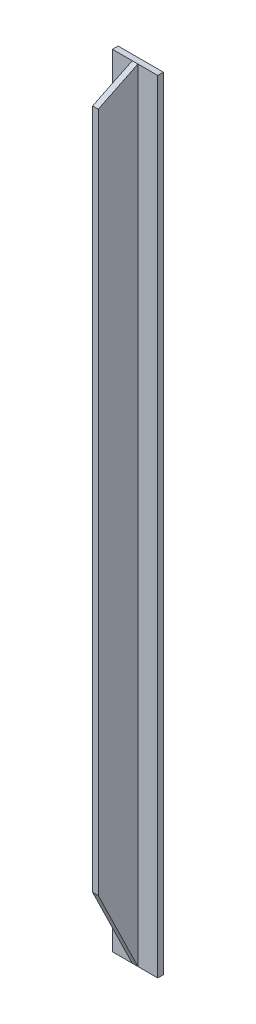
ISO-10303-21;
HEADER;
FILE_DESCRIPTION(('STEP AP214'),'2;1');
FILE_NAME('part.step','',(''),(''),'','','');
FILE_SCHEMA(('AUTOMOTIVE_DESIGN { 1 0 10303 214 1 1 1 1 }'));
ENDSEC;
DATA;
#1=APPLICATION_CONTEXT('core data for automotive mechanical design processes');
#2=APPLICATION_PROTOCOL_DEFINITION('international standard','automotive_design',2000,#1);
#3=PRODUCT_CONTEXT('',#1,'mechanical');
#4=PRODUCT('Part','Part','',(#3));
#5=PRODUCT_RELATED_PRODUCT_CATEGORY('part','',(#4));
#6=PRODUCT_DEFINITION_FORMATION('','',#4);
#7=PRODUCT_DEFINITION_CONTEXT('part definition',#1,'design');
#8=PRODUCT_DEFINITION('design','',#6,#7);
#9=PRODUCT_DEFINITION_SHAPE('','',#8);
#10=(LENGTH_UNIT() NAMED_UNIT(*) SI_UNIT(.MILLI.,.METRE.));
#11=(NAMED_UNIT(*) PLANE_ANGLE_UNIT() SI_UNIT($,.RADIAN.));
#12=(NAMED_UNIT(*) SI_UNIT($,.STERADIAN.) SOLID_ANGLE_UNIT());
#13=UNCERTAINTY_MEASURE_WITH_UNIT(LENGTH_MEASURE(1.E-05),#10,'distance_accuracy_value','');
#14=(GEOMETRIC_REPRESENTATION_CONTEXT(3) GLOBAL_UNCERTAINTY_ASSIGNED_CONTEXT((#13)) GLOBAL_UNIT_ASSIGNED_CONTEXT((#10,
#11,#12)) REPRESENTATION_CONTEXT('',''));
#15=CARTESIAN_POINT('',(0.,0.,0.));
#16=DIRECTION('',(0.,0.,1.));
#17=DIRECTION('',(1.,0.,0.));
#18=AXIS2_PLACEMENT_3D('',#15,#16,#17);
#19=CARTESIAN_POINT('',(14.2875,438.15,-22.225));
#20=DIRECTION('',(0.,0.,-1.));
#21=DIRECTION('',(-1.,0.,0.));
#22=AXIS2_PLACEMENT_3D('',#19,#20,#21);
#23=PLANE('',#22);
#24=DIRECTION('',(1.,0.,0.));
#25=VECTOR('',#24,1.);
#26=CARTESIAN_POINT('',(14.2875,0.,-22.225));
#27=LINE('',#26,#25);
#28=CARTESIAN_POINT('',(3.175,0.,-22.225));
#29=VERTEX_POINT('',#28);
#30=CARTESIAN_POINT('',(14.2875,0.,-22.225));
#31=VERTEX_POINT('',#30);
#32=EDGE_CURVE('E130',#29,#31,#27,.T.);
#33=ORIENTED_EDGE('',*,*,#32,.T.);
#34=DIRECTION('',(0.,-1.,0.));
#35=VECTOR('',#34,1.);
#36=CARTESIAN_POINT('',(14.2875,438.15,-22.225));
#37=LINE('',#36,#35);
#38=CARTESIAN_POINT('',(14.2875,438.15,-22.225));
#39=VERTEX_POINT('',#38);
#40=EDGE_CURVE('E166',#39,#31,#37,.T.);
#41=ORIENTED_EDGE('',*,*,#40,.F.);
#42=DIRECTION('',(1.,0.,0.));
#43=VECTOR('',#42,1.);
#44=CARTESIAN_POINT('',(14.2875,438.15,-22.225));
#45=LINE('',#44,#43);
#46=CARTESIAN_POINT('',(3.175,438.15,-22.225));
#47=VERTEX_POINT('',#46);
#48=EDGE_CURVE('E146',#47,#39,#45,.T.);
#49=ORIENTED_EDGE('',*,*,#48,.F.);
#50=DIRECTION('',(0.,-1.,0.));
#51=VECTOR('',#50,1.);
#52=CARTESIAN_POINT('',(3.175,438.15,-22.225));
#53=LINE('',#52,#51);
#54=EDGE_CURVE('E126',#47,#29,#53,.T.);
#55=ORIENTED_EDGE('',*,*,#54,.T.);
#56=EDGE_LOOP('',(#33,#41,#49,#55));
#57=FACE_BOUND('',#56,.T.);
#58=ADVANCED_FACE('F39',(#57),#23,.F.);
#59=CARTESIAN_POINT('',(14.2875,438.15,-22.225));
#60=DIRECTION('',(-1.,0.,0.));
#61=DIRECTION('',(0.,0.,1.));
#62=AXIS2_PLACEMENT_3D('',#59,#60,#61);
#63=PLANE('',#62);
#64=DIRECTION('',(0.,0.,-1.));
#65=VECTOR('',#64,1.);
#66=CARTESIAN_POINT('',(14.2875,0.,-22.225));
#67=LINE('',#66,#65);
#68=CARTESIAN_POINT('',(14.2875,0.,-25.4));
#69=VERTEX_POINT('',#68);
#70=EDGE_CURVE('E134',#31,#69,#67,.T.);
#71=ORIENTED_EDGE('',*,*,#70,.T.);
#72=DIRECTION('',(0.,-1.,0.));
#73=VECTOR('',#72,1.);
#74=CARTESIAN_POINT('',(14.2875,438.15,-25.4));
#75=LINE('',#74,#73);
#76=CARTESIAN_POINT('',(14.2875,438.15,-25.4));
#77=VERTEX_POINT('',#76);
#78=EDGE_CURVE('E117',#77,#69,#75,.T.);
#79=ORIENTED_EDGE('',*,*,#78,.F.);
#80=DIRECTION('',(0.,0.,-1.));
#81=VECTOR('',#80,1.);
#82=CARTESIAN_POINT('',(14.2875,438.15,-22.225));
#83=LINE('',#82,#81);
#84=EDGE_CURVE('E94',#39,#77,#83,.T.);
#85=ORIENTED_EDGE('',*,*,#84,.F.);
#86=ORIENTED_EDGE('',*,*,#40,.T.);
#87=EDGE_LOOP('',(#71,#79,#85,#86));
#88=FACE_BOUND('',#87,.T.);
#89=ADVANCED_FACE('F193',(#88),#63,.F.);
#90=CARTESIAN_POINT('',(14.2875,438.15,-25.4));
#91=DIRECTION('',(0.,0.,1.));
#92=DIRECTION('',(1.,0.,0.));
#93=AXIS2_PLACEMENT_3D('',#90,#91,#92);
#94=PLANE('',#93);
#95=DIRECTION('',(-1.,0.,0.));
#96=VECTOR('',#95,1.);
#97=CARTESIAN_POINT('',(14.2875,0.,-25.4));
#98=LINE('',#97,#96);
#99=CARTESIAN_POINT('',(-11.1125,0.,-25.4));
#100=VERTEX_POINT('',#99);
#101=EDGE_CURVE('E115',#69,#100,#98,.T.);
#102=ORIENTED_EDGE('',*,*,#101,.T.);
#103=DIRECTION('',(0.,-1.,0.));
#104=VECTOR('',#103,1.);
#105=CARTESIAN_POINT('',(-11.1125,438.15,-25.4));
#106=LINE('',#105,#104);
#107=CARTESIAN_POINT('',(-11.1125,438.15,-25.4));
#108=VERTEX_POINT('',#107);
#109=EDGE_CURVE('E112',#108,#100,#106,.T.);
#110=ORIENTED_EDGE('',*,*,#109,.F.);
#111=DIRECTION('',(-1.,0.,0.));
#112=VECTOR('',#111,1.);
#113=CARTESIAN_POINT('',(14.2875,438.15,-25.4));
#114=LINE('',#113,#112);
#115=EDGE_CURVE('E102',#77,#108,#114,.T.);
#116=ORIENTED_EDGE('',*,*,#115,.F.);
#117=ORIENTED_EDGE('',*,*,#78,.T.);
#118=EDGE_LOOP('',(#102,#110,#116,#117));
#119=FACE_BOUND('',#118,.T.);
#120=ADVANCED_FACE('F113',(#119),#94,.F.);
#121=CARTESIAN_POINT('',(-11.1125,438.15,-22.225));
#122=DIRECTION('',(1.,0.,0.));
#123=DIRECTION('',(0.,0.,-1.));
#124=AXIS2_PLACEMENT_3D('',#121,#122,#123);
#125=PLANE('',#124);
#126=DIRECTION('',(0.,0.,1.));
#127=VECTOR('',#126,1.);
#128=CARTESIAN_POINT('',(-11.1125,0.,-22.225));
#129=LINE('',#128,#127);
#130=CARTESIAN_POINT('',(-11.1125,0.,-22.225));
#131=VERTEX_POINT('',#130);
#132=EDGE_CURVE('E77',#100,#131,#129,.T.);
#133=ORIENTED_EDGE('',*,*,#132,.T.);
#134=DIRECTION('',(0.,-1.,0.));
#135=VECTOR('',#134,1.);
#136=CARTESIAN_POINT('',(-11.1125,438.15,-22.225));
#137=LINE('',#136,#135);
#138=CARTESIAN_POINT('',(-11.1125,438.15,-22.225));
#139=VERTEX_POINT('',#138);
#140=EDGE_CURVE('E118',#139,#131,#137,.T.);
#141=ORIENTED_EDGE('',*,*,#140,.F.);
#142=DIRECTION('',(0.,0.,1.));
#143=VECTOR('',#142,1.);
#144=CARTESIAN_POINT('',(-11.1125,438.15,-22.225));
#145=LINE('',#144,#143);
#146=EDGE_CURVE('E107',#108,#139,#145,.T.);
#147=ORIENTED_EDGE('',*,*,#146,.F.);
#148=ORIENTED_EDGE('',*,*,#109,.T.);
#149=EDGE_LOOP('',(#133,#141,#147,#148));
#150=FACE_BOUND('',#149,.T.);
#151=ADVANCED_FACE('F120',(#150),#125,.F.);
#152=CARTESIAN_POINT('',(0.,438.15,-22.225));
#153=DIRECTION('',(0.,0.,-1.));
#154=DIRECTION('',(-1.,0.,0.));
#155=AXIS2_PLACEMENT_3D('',#152,#153,#154);
#156=PLANE('',#155);
#157=DIRECTION('',(1.,0.,0.));
#158=VECTOR('',#157,1.);
#159=CARTESIAN_POINT('',(0.,0.,-22.225));
#160=LINE('',#159,#158);
#161=CARTESIAN_POINT('',(0.,0.,-22.225));
#162=VERTEX_POINT('',#161);
#163=EDGE_CURVE('E142',#131,#162,#160,.T.);
#164=ORIENTED_EDGE('',*,*,#163,.T.);
#165=DIRECTION('',(0.,-1.,0.));
#166=VECTOR('',#165,1.);
#167=CARTESIAN_POINT('',(0.,438.15,-22.225));
#168=LINE('',#167,#166);
#169=CARTESIAN_POINT('',(0.,438.15,-22.225));
#170=VERTEX_POINT('',#169);
#171=EDGE_CURVE('E158',#170,#162,#168,.T.);
#172=ORIENTED_EDGE('',*,*,#171,.F.);
#173=DIRECTION('',(1.,0.,0.));
#174=VECTOR('',#173,1.);
#175=CARTESIAN_POINT('',(0.,438.15,-22.225));
#176=LINE('',#175,#174);
#177=EDGE_CURVE('E123',#139,#170,#176,.T.);
#178=ORIENTED_EDGE('',*,*,#177,.F.);
#179=ORIENTED_EDGE('',*,*,#140,.T.);
#180=EDGE_LOOP('',(#164,#172,#178,#179));
#181=FACE_BOUND('',#180,.T.);
#182=ADVANCED_FACE('F203',(#181),#156,.F.);
#183=CARTESIAN_POINT('',(0.,438.15,0.));
#184=DIRECTION('',(1.,0.,0.));
#185=DIRECTION('',(0.,0.,-1.));
#186=AXIS2_PLACEMENT_3D('',#183,#184,#185);
#187=PLANE('',#186);
#188=ORIENTED_EDGE('',*,*,#171,.T.);
#189=DIRECTION('',(0.,0.898794046299165,0.438371146789081));
#190=VECTOR('',#189,1.);
#191=CARTESIAN_POINT('',(0.,362.707807206422,154.679417701838));
#192=LINE('',#191,#190);
#193=CARTESIAN_POINT('',(0.,45.5680028790993,0.));
#194=VERTEX_POINT('',#193);
#195=EDGE_CURVE('E85',#162,#194,#192,.T.);
#196=ORIENTED_EDGE('',*,*,#195,.T.);
#197=DIRECTION('',(0.,-1.,0.));
#198=VECTOR('',#197,1.);
#199=CARTESIAN_POINT('',(0.,438.15,0.));
#200=LINE('',#199,#198);
#201=CARTESIAN_POINT('',(0.,427.310143219124,0.));
#202=VERTEX_POINT('',#201);
#203=EDGE_CURVE('E154',#202,#194,#200,.T.);
#204=ORIENTED_EDGE('',*,*,#203,.F.);
#205=DIRECTION('',(0.,0.438371146789073,-0.898794046299169));
#206=VECTOR('',#205,1.);
#207=CARTESIAN_POINT('',(0.,429.393230500545,-4.27096185544353));
#208=LINE('',#207,#206);
#209=EDGE_CURVE('E135',#202,#170,#208,.T.);
#210=ORIENTED_EDGE('',*,*,#209,.T.);
#211=EDGE_LOOP('',(#188,#196,#204,#210));
#212=FACE_BOUND('',#211,.T.);
#213=ADVANCED_FACE('F206',(#212),#187,.F.);
#214=CARTESIAN_POINT('',(0.,438.15,0.));
#215=DIRECTION('',(0.,0.,-1.));
#216=DIRECTION('',(-1.,0.,0.));
#217=AXIS2_PLACEMENT_3D('',#214,#215,#216);
#218=PLANE('',#217);
#219=ORIENTED_EDGE('',*,*,#203,.T.);
#220=DIRECTION('',(1.,0.,0.));
#221=VECTOR('',#220,1.);
#222=CARTESIAN_POINT('',(-434.975,45.5680028790993,0.));
#223=LINE('',#222,#221);
#224=CARTESIAN_POINT('',(3.175,45.5680028790993,0.));
#225=VERTEX_POINT('',#224);
#226=EDGE_CURVE('E187',#194,#225,#223,.T.);
#227=ORIENTED_EDGE('',*,*,#226,.T.);
#228=DIRECTION('',(0.,-1.,0.));
#229=VECTOR('',#228,1.);
#230=CARTESIAN_POINT('',(3.175,438.15,0.));
#231=LINE('',#230,#229);
#232=CARTESIAN_POINT('',(3.175,427.310143219124,0.));
#233=VERTEX_POINT('',#232);
#234=EDGE_CURVE('E150',#233,#225,#231,.T.);
#235=ORIENTED_EDGE('',*,*,#234,.F.);
#236=DIRECTION('',(1.,0.,0.));
#237=VECTOR('',#236,1.);
#238=CARTESIAN_POINT('',(-434.975,427.310143219124,0.));
#239=LINE('',#238,#237);
#240=EDGE_CURVE('E188',#202,#233,#239,.T.);
#241=ORIENTED_EDGE('',*,*,#240,.F.);
#242=EDGE_LOOP('',(#219,#227,#235,#241));
#243=FACE_BOUND('',#242,.T.);
#244=ADVANCED_FACE('F210',(#243),#218,.F.);
#245=CARTESIAN_POINT('',(3.175,438.15,0.));
#246=DIRECTION('',(-1.,0.,0.));
#247=DIRECTION('',(0.,0.,1.));
#248=AXIS2_PLACEMENT_3D('',#245,#246,#247);
#249=PLANE('',#248);
#250=ORIENTED_EDGE('',*,*,#234,.T.);
#251=DIRECTION('',(0.,0.898794046299165,0.438371146789081));
#252=VECTOR('',#251,1.);
#253=CARTESIAN_POINT('',(3.175,0.,-22.225));
#254=LINE('',#253,#252);
#255=EDGE_CURVE('E174',#29,#225,#254,.T.);
#256=ORIENTED_EDGE('',*,*,#255,.F.);
#257=ORIENTED_EDGE('',*,*,#54,.F.);
#258=DIRECTION('',(0.,0.438371146789073,-0.898794046299169));
#259=VECTOR('',#258,1.);
#260=CARTESIAN_POINT('',(3.175,438.15,-22.225));
#261=LINE('',#260,#259);
#262=EDGE_CURVE('E56',#233,#47,#261,.T.);
#263=ORIENTED_EDGE('',*,*,#262,.F.);
#264=EDGE_LOOP('',(#250,#256,#257,#263));
#265=FACE_BOUND('',#264,.T.);
#266=ADVANCED_FACE('F183',(#265),#249,.F.);
#267=CARTESIAN_POINT('',(0.,438.15,0.));
#268=DIRECTION('',(0.,-1.,0.));
#269=DIRECTION('',(0.,0.,-1.));
#270=AXIS2_PLACEMENT_3D('',#267,#268,#269);
#271=PLANE('',#270);
#272=ORIENTED_EDGE('',*,*,#177,.T.);
#273=DIRECTION('',(1.,0.,0.));
#274=VECTOR('',#273,1.);
#275=CARTESIAN_POINT('',(0.,438.15,-22.225));
#276=LINE('',#275,#274);
#277=EDGE_CURVE('E11',#170,#47,#276,.T.);
#278=ORIENTED_EDGE('',*,*,#277,.T.);
#279=ORIENTED_EDGE('',*,*,#48,.T.);
#280=ORIENTED_EDGE('',*,*,#84,.T.);
#281=ORIENTED_EDGE('',*,*,#115,.T.);
#282=ORIENTED_EDGE('',*,*,#146,.T.);
#283=EDGE_LOOP('',(#272,#278,#279,#280,#281,#282));
#284=FACE_BOUND('',#283,.T.);
#285=ADVANCED_FACE('F105',(#284),#271,.F.);
#286=CARTESIAN_POINT('',(0.,0.,0.));
#287=DIRECTION('',(0.,-1.,0.));
#288=DIRECTION('',(0.,0.,-1.));
#289=AXIS2_PLACEMENT_3D('',#286,#287,#288);
#290=PLANE('',#289);
#291=DIRECTION('',(1.,0.,0.));
#292=VECTOR('',#291,1.);
#293=CARTESIAN_POINT('',(0.,0.,-22.225));
#294=LINE('',#293,#292);
#295=EDGE_CURVE('E48',#162,#29,#294,.T.);
#296=ORIENTED_EDGE('',*,*,#295,.F.);
#297=ORIENTED_EDGE('',*,*,#163,.F.);
#298=ORIENTED_EDGE('',*,*,#132,.F.);
#299=ORIENTED_EDGE('',*,*,#101,.F.);
#300=ORIENTED_EDGE('',*,*,#70,.F.);
#301=ORIENTED_EDGE('',*,*,#32,.F.);
#302=EDGE_LOOP('',(#296,#297,#298,#299,#300,#301));
#303=FACE_BOUND('',#302,.T.);
#304=ADVANCED_FACE('F192',(#303),#290,.T.);
#305=CARTESIAN_POINT('',(-434.975,0.,-22.2249999999999));
#306=DIRECTION('',(0.,0.438371146789081,-0.898794046299165));
#307=DIRECTION('',(0.,0.898794046299165,0.438371146789081));
#308=AXIS2_PLACEMENT_3D('',#305,#306,#307);
#309=PLANE('',#308);
#310=ORIENTED_EDGE('',*,*,#295,.T.);
#311=ORIENTED_EDGE('',*,*,#255,.T.);
#312=ORIENTED_EDGE('',*,*,#226,.F.);
#313=ORIENTED_EDGE('',*,*,#195,.F.);
#314=EDGE_LOOP('',(#310,#311,#312,#313));
#315=FACE_BOUND('',#314,.T.);
#316=ADVANCED_FACE('F172',(#315),#309,.F.);
#317=CARTESIAN_POINT('',(-434.975,438.15,-22.2249999999999));
#318=DIRECTION('',(0.,-0.898794046299169,-0.438371146789073));
#319=DIRECTION('',(0.,0.438371146789073,-0.898794046299169));
#320=AXIS2_PLACEMENT_3D('',#317,#318,#319);
#321=PLANE('',#320);
#322=ORIENTED_EDGE('',*,*,#240,.T.);
#323=ORIENTED_EDGE('',*,*,#262,.T.);
#324=ORIENTED_EDGE('',*,*,#277,.F.);
#325=ORIENTED_EDGE('',*,*,#209,.F.);
#326=EDGE_LOOP('',(#322,#323,#324,#325));
#327=FACE_BOUND('',#326,.T.);
#328=ADVANCED_FACE('F221',(#327),#321,.F.);
#329=CLOSED_SHELL('',(#58,#89,#120,#151,#182,#213,#244,#266,#285,#304,#316,#328));
#330=MANIFOLD_SOLID_BREP('B2',#329);
#331=ADVANCED_BREP_SHAPE_REPRESENTATION('',(#18,#330),#14);
#332=SHAPE_DEFINITION_REPRESENTATION(#9,#331);
ENDSEC;
END-ISO-10303-21;
